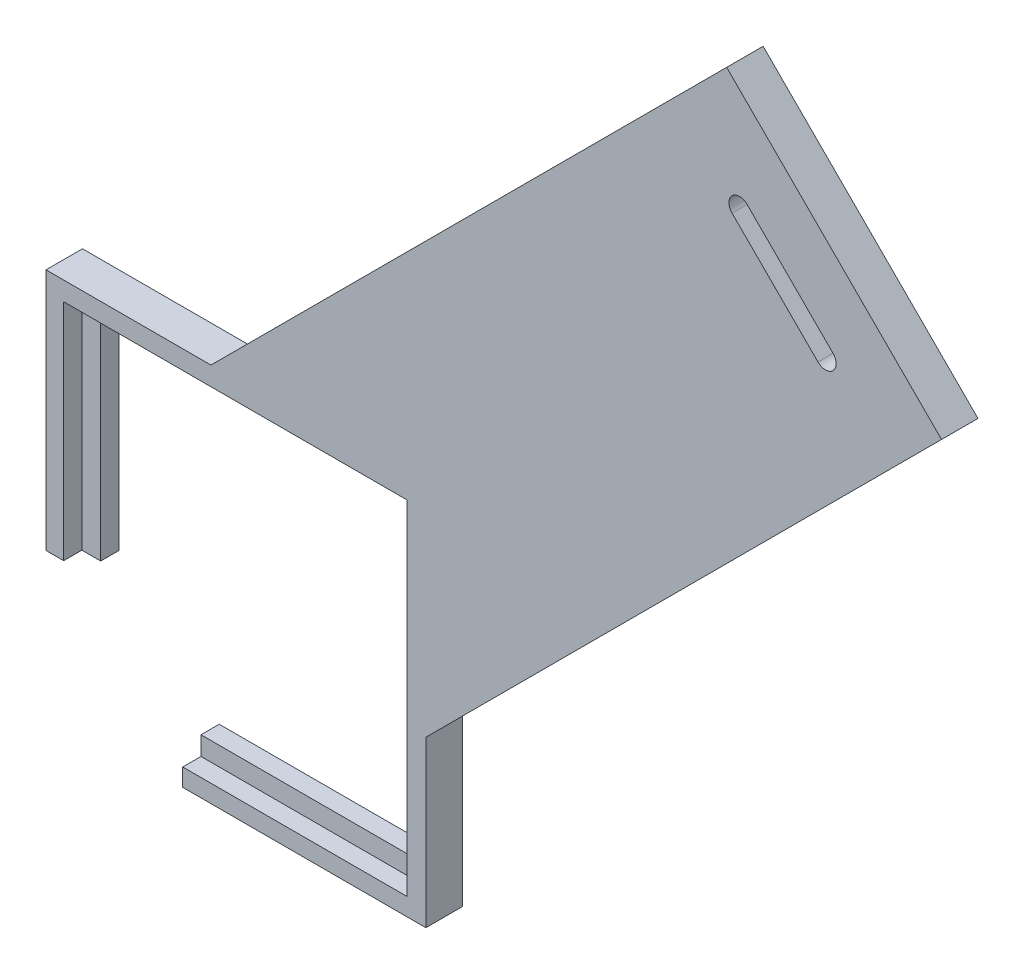
ISO-10303-21;
HEADER;
FILE_DESCRIPTION(('STEP AP214'),'2;1');
FILE_NAME('part.step','',(''),(''),'','','');
FILE_SCHEMA(('AUTOMOTIVE_DESIGN { 1 0 10303 214 1 1 1 1 }'));
ENDSEC;
DATA;
#1=APPLICATION_CONTEXT('core data for automotive mechanical design processes');
#2=APPLICATION_PROTOCOL_DEFINITION('international standard','automotive_design',2000,#1);
#3=PRODUCT_CONTEXT('',#1,'mechanical');
#4=PRODUCT('Part','Part','',(#3));
#5=PRODUCT_RELATED_PRODUCT_CATEGORY('part','',(#4));
#6=PRODUCT_DEFINITION_FORMATION('','',#4);
#7=PRODUCT_DEFINITION_CONTEXT('part definition',#1,'design');
#8=PRODUCT_DEFINITION('design','',#6,#7);
#9=PRODUCT_DEFINITION_SHAPE('','',#8);
#10=(LENGTH_UNIT() NAMED_UNIT(*) SI_UNIT(.MILLI.,.METRE.));
#11=(NAMED_UNIT(*) PLANE_ANGLE_UNIT() SI_UNIT($,.RADIAN.));
#12=(NAMED_UNIT(*) SI_UNIT($,.STERADIAN.) SOLID_ANGLE_UNIT());
#13=UNCERTAINTY_MEASURE_WITH_UNIT(LENGTH_MEASURE(1.E-05),#10,'distance_accuracy_value','');
#14=(GEOMETRIC_REPRESENTATION_CONTEXT(3) GLOBAL_UNCERTAINTY_ASSIGNED_CONTEXT((#13)) GLOBAL_UNIT_ASSIGNED_CONTEXT((#10,
#11,#12)) REPRESENTATION_CONTEXT('',''));
#15=CARTESIAN_POINT('',(0.,0.,0.));
#16=DIRECTION('',(0.,0.,1.));
#17=DIRECTION('',(1.,0.,0.));
#18=AXIS2_PLACEMENT_3D('',#15,#16,#17);
#19=CARTESIAN_POINT('',(-1.04083408558608E-13,62.5000000000001,6.));
#20=DIRECTION('',(0.,-1.,0.));
#21=DIRECTION('',(1.,0.,0.));
#22=AXIS2_PLACEMENT_3D('',#19,#20,#21);
#23=PLANE('',#22);
#24=DIRECTION('',(-1.,0.,0.));
#25=VECTOR('',#24,1.);
#26=CARTESIAN_POINT('',(-1.04083408558608E-13,62.5000000000001,0.));
#27=LINE('',#26,#25);
#28=CARTESIAN_POINT('',(27.1446609406726,62.5000000000001,0.));
#29=VERTEX_POINT('',#28);
#30=CARTESIAN_POINT('',(-1.04083408558608E-13,62.5000000000001,0.));
#31=VERTEX_POINT('',#30);
#32=EDGE_CURVE('E266',#29,#31,#27,.T.);
#33=ORIENTED_EDGE('',*,*,#32,.T.);
#34=DIRECTION('',(0.,0.,-1.));
#35=VECTOR('',#34,1.);
#36=CARTESIAN_POINT('',(-1.04083408558608E-13,62.5000000000001,6.));
#37=LINE('',#36,#35);
#38=CARTESIAN_POINT('',(-1.04083408558608E-13,62.5000000000001,6.));
#39=VERTEX_POINT('',#38);
#40=EDGE_CURVE('E349',#39,#31,#37,.T.);
#41=ORIENTED_EDGE('',*,*,#40,.F.);
#42=DIRECTION('',(-1.,0.,0.));
#43=VECTOR('',#42,1.);
#44=CARTESIAN_POINT('',(-1.04083408558608E-13,62.5000000000001,6.));
#45=LINE('',#44,#43);
#46=CARTESIAN_POINT('',(27.1446609406726,62.5000000000001,6.));
#47=VERTEX_POINT('',#46);
#48=EDGE_CURVE('E267',#47,#39,#45,.T.);
#49=ORIENTED_EDGE('',*,*,#48,.F.);
#50=DIRECTION('',(0.,0.,-1.));
#51=VECTOR('',#50,1.);
#52=CARTESIAN_POINT('',(27.1446609406726,62.5000000000001,6.));
#53=LINE('',#52,#51);
#54=EDGE_CURVE('E288',#47,#29,#53,.T.);
#55=ORIENTED_EDGE('',*,*,#54,.T.);
#56=EDGE_LOOP('',(#33,#41,#49,#55));
#57=FACE_BOUND('',#56,.T.);
#58=ADVANCED_FACE('F35',(#57),#23,.F.);
#59=CARTESIAN_POINT('',(-1.04083408558608E-13,22.5000000000001,6.));
#60=DIRECTION('',(1.,0.,0.));
#61=DIRECTION('',(0.,0.,-1.));
#62=AXIS2_PLACEMENT_3D('',#59,#60,#61);
#63=PLANE('',#62);
#64=DIRECTION('',(0.,-1.,0.));
#65=VECTOR('',#64,1.);
#66=CARTESIAN_POINT('',(-1.04083408558608E-13,22.5000000000001,0.));
#67=LINE('',#66,#65);
#68=CARTESIAN_POINT('',(-1.04083408558608E-13,22.5000000000001,0.));
#69=VERTEX_POINT('',#68);
#70=EDGE_CURVE('E291',#31,#69,#67,.T.);
#71=ORIENTED_EDGE('',*,*,#70,.T.);
#72=DIRECTION('',(0.,0.,-1.));
#73=VECTOR('',#72,1.);
#74=CARTESIAN_POINT('',(-1.04083408558608E-13,22.5000000000001,6.));
#75=LINE('',#74,#73);
#76=CARTESIAN_POINT('',(-1.04083408558608E-13,22.5000000000001,6.));
#77=VERTEX_POINT('',#76);
#78=EDGE_CURVE('E346',#77,#69,#75,.T.);
#79=ORIENTED_EDGE('',*,*,#78,.F.);
#80=DIRECTION('',(0.,-1.,0.));
#81=VECTOR('',#80,1.);
#82=CARTESIAN_POINT('',(-1.04083408558608E-13,22.5000000000001,6.));
#83=LINE('',#82,#81);
#84=EDGE_CURVE('E270',#39,#77,#83,.T.);
#85=ORIENTED_EDGE('',*,*,#84,.F.);
#86=ORIENTED_EDGE('',*,*,#40,.T.);
#87=EDGE_LOOP('',(#71,#79,#85,#86));
#88=FACE_BOUND('',#87,.T.);
#89=ADVANCED_FACE('F407',(#88),#63,.F.);
#90=CARTESIAN_POINT('',(-1.04083408558608E-13,22.5000000000001,6.));
#91=DIRECTION('',(0.,1.,0.));
#92=DIRECTION('',(0.,0.,1.));
#93=AXIS2_PLACEMENT_3D('',#90,#91,#92);
#94=PLANE('',#93);
#95=DIRECTION('',(-1.,0.,0.));
#96=VECTOR('',#95,1.);
#97=CARTESIAN_POINT('',(-1.04083408558608E-13,22.5000000000001,3.));
#98=LINE('',#97,#96);
#99=CARTESIAN_POINT('',(5.99999999999988,22.5000000000001,3.));
#100=VERTEX_POINT('',#99);
#101=CARTESIAN_POINT('',(2.90653806295707,22.5000000000001,3.));
#102=VERTEX_POINT('',#101);
#103=EDGE_CURVE('E263',#100,#102,#98,.T.);
#104=ORIENTED_EDGE('',*,*,#103,.T.);
#105=DIRECTION('',(0.,0.,1.));
#106=VECTOR('',#105,1.);
#107=CARTESIAN_POINT('',(2.90653806295707,22.5000000000001,6.));
#108=LINE('',#107,#106);
#109=CARTESIAN_POINT('',(2.90653806295707,22.5000000000001,6.));
#110=VERTEX_POINT('',#109);
#111=EDGE_CURVE('E241',#102,#110,#108,.T.);
#112=ORIENTED_EDGE('',*,*,#111,.T.);
#113=DIRECTION('',(1.,0.,0.));
#114=VECTOR('',#113,1.);
#115=CARTESIAN_POINT('',(-1.04083408558608E-13,22.5000000000001,6.));
#116=LINE('',#115,#114);
#117=EDGE_CURVE('E273',#77,#110,#116,.T.);
#118=ORIENTED_EDGE('',*,*,#117,.F.);
#119=ORIENTED_EDGE('',*,*,#78,.T.);
#120=DIRECTION('',(1.,0.,0.));
#121=VECTOR('',#120,1.);
#122=CARTESIAN_POINT('',(-1.04083408558608E-13,22.5000000000001,0.));
#123=LINE('',#122,#121);
#124=CARTESIAN_POINT('',(5.99999999999988,22.5000000000001,0.));
#125=VERTEX_POINT('',#124);
#126=EDGE_CURVE('E293',#69,#125,#123,.T.);
#127=ORIENTED_EDGE('',*,*,#126,.T.);
#128=DIRECTION('',(0.,0.,-1.));
#129=VECTOR('',#128,1.);
#130=CARTESIAN_POINT('',(5.99999999999988,22.5000000000001,6.));
#131=LINE('',#130,#129);
#132=EDGE_CURVE('E344',#100,#125,#131,.T.);
#133=ORIENTED_EDGE('',*,*,#132,.F.);
#134=EDGE_LOOP('',(#104,#112,#118,#119,#127,#133));
#135=FACE_BOUND('',#134,.T.);
#136=ADVANCED_FACE('F410',(#135),#94,.F.);
#137=CARTESIAN_POINT('',(5.99999999999987,56.5000000000001,6.));
#138=DIRECTION('',(-1.,0.,0.));
#139=DIRECTION('',(0.,-1.,0.));
#140=AXIS2_PLACEMENT_3D('',#137,#138,#139);
#141=PLANE('',#140);
#142=DIRECTION('',(0.,0.,-1.));
#143=VECTOR('',#142,1.);
#144=CARTESIAN_POINT('',(5.99999999999987,56.5000000000001,6.));
#145=LINE('',#144,#143);
#146=CARTESIAN_POINT('',(5.99999999999987,56.5000000000001,3.));
#147=VERTEX_POINT('',#146);
#148=CARTESIAN_POINT('',(5.99999999999987,56.5000000000001,0.));
#149=VERTEX_POINT('',#148);
#150=EDGE_CURVE('E342',#147,#149,#145,.T.);
#151=ORIENTED_EDGE('',*,*,#150,.F.);
#152=DIRECTION('',(0.,-1.,0.));
#153=VECTOR('',#152,1.);
#154=CARTESIAN_POINT('',(5.99999999999987,56.5000000000001,3.));
#155=LINE('',#154,#153);
#156=EDGE_CURVE('E260',#147,#100,#155,.T.);
#157=ORIENTED_EDGE('',*,*,#156,.T.);
#158=ORIENTED_EDGE('',*,*,#132,.T.);
#159=DIRECTION('',(0.,1.,0.));
#160=VECTOR('',#159,1.);
#161=CARTESIAN_POINT('',(5.99999999999987,56.5000000000001,0.));
#162=LINE('',#161,#160);
#163=EDGE_CURVE('E296',#125,#149,#162,.T.);
#164=ORIENTED_EDGE('',*,*,#163,.T.);
#165=EDGE_LOOP('',(#151,#157,#158,#164));
#166=FACE_BOUND('',#165,.T.);
#167=ADVANCED_FACE('F416',(#166),#141,.F.);
#168=CARTESIAN_POINT('',(56.4999999999999,56.5000000000001,6.));
#169=DIRECTION('',(0.,1.,0.));
#170=DIRECTION('',(-1.,0.,0.));
#171=AXIS2_PLACEMENT_3D('',#168,#169,#170);
#172=PLANE('',#171);
#173=DIRECTION('',(0.,0.,-1.));
#174=VECTOR('',#173,1.);
#175=CARTESIAN_POINT('',(56.4999999999999,56.5000000000001,6.));
#176=LINE('',#175,#174);
#177=CARTESIAN_POINT('',(56.4999999999999,56.5000000000001,3.));
#178=VERTEX_POINT('',#177);
#179=CARTESIAN_POINT('',(56.4999999999999,56.5000000000001,0.));
#180=VERTEX_POINT('',#179);
#181=EDGE_CURVE('E340',#178,#180,#176,.T.);
#182=ORIENTED_EDGE('',*,*,#181,.F.);
#183=DIRECTION('',(-1.,0.,0.));
#184=VECTOR('',#183,1.);
#185=CARTESIAN_POINT('',(56.4999999999999,56.5000000000001,3.));
#186=LINE('',#185,#184);
#187=EDGE_CURVE('E257',#178,#147,#186,.T.);
#188=ORIENTED_EDGE('',*,*,#187,.T.);
#189=ORIENTED_EDGE('',*,*,#150,.T.);
#190=DIRECTION('',(1.,0.,0.));
#191=VECTOR('',#190,1.);
#192=CARTESIAN_POINT('',(56.4999999999999,56.5000000000001,0.));
#193=LINE('',#192,#191);
#194=EDGE_CURVE('E299',#149,#180,#193,.T.);
#195=ORIENTED_EDGE('',*,*,#194,.T.);
#196=EDGE_LOOP('',(#182,#188,#189,#195));
#197=FACE_BOUND('',#196,.T.);
#198=ADVANCED_FACE('F423',(#197),#172,.F.);
#199=CARTESIAN_POINT('',(56.4999999999999,56.5000000000001,6.));
#200=DIRECTION('',(1.,0.,0.));
#201=DIRECTION('',(0.,1.,0.));
#202=AXIS2_PLACEMENT_3D('',#199,#200,#201);
#203=PLANE('',#202);
#204=DIRECTION('',(0.,0.,-1.));
#205=VECTOR('',#204,1.);
#206=CARTESIAN_POINT('',(56.4999999999999,6.00000000000008,6.));
#207=LINE('',#206,#205);
#208=CARTESIAN_POINT('',(56.4999999999999,6.00000000000008,3.));
#209=VERTEX_POINT('',#208);
#210=CARTESIAN_POINT('',(56.4999999999999,6.00000000000008,0.));
#211=VERTEX_POINT('',#210);
#212=EDGE_CURVE('E338',#209,#211,#207,.T.);
#213=ORIENTED_EDGE('',*,*,#212,.F.);
#214=DIRECTION('',(0.,1.,0.));
#215=VECTOR('',#214,1.);
#216=CARTESIAN_POINT('',(56.4999999999999,56.5000000000001,3.));
#217=LINE('',#216,#215);
#218=EDGE_CURVE('E254',#209,#178,#217,.T.);
#219=ORIENTED_EDGE('',*,*,#218,.T.);
#220=ORIENTED_EDGE('',*,*,#181,.T.);
#221=DIRECTION('',(0.,-1.,0.));
#222=VECTOR('',#221,1.);
#223=CARTESIAN_POINT('',(56.4999999999999,56.5000000000001,0.));
#224=LINE('',#223,#222);
#225=EDGE_CURVE('E302',#180,#211,#224,.T.);
#226=ORIENTED_EDGE('',*,*,#225,.T.);
#227=EDGE_LOOP('',(#213,#219,#220,#226));
#228=FACE_BOUND('',#227,.T.);
#229=ADVANCED_FACE('F426',(#228),#203,.F.);
#230=CARTESIAN_POINT('',(56.4999999999999,6.00000000000008,6.));
#231=DIRECTION('',(0.,-1.,0.));
#232=DIRECTION('',(1.,0.,0.));
#233=AXIS2_PLACEMENT_3D('',#230,#231,#232);
#234=PLANE('',#233);
#235=DIRECTION('',(0.,0.,-1.));
#236=VECTOR('',#235,1.);
#237=CARTESIAN_POINT('',(22.4999999999999,6.00000000000008,6.));
#238=LINE('',#237,#236);
#239=CARTESIAN_POINT('',(22.4999999999999,6.00000000000008,3.));
#240=VERTEX_POINT('',#239);
#241=CARTESIAN_POINT('',(22.4999999999999,6.00000000000008,0.));
#242=VERTEX_POINT('',#241);
#243=EDGE_CURVE('E336',#240,#242,#238,.T.);
#244=ORIENTED_EDGE('',*,*,#243,.F.);
#245=DIRECTION('',(1.,0.,0.));
#246=VECTOR('',#245,1.);
#247=CARTESIAN_POINT('',(56.4999999999999,6.00000000000008,3.));
#248=LINE('',#247,#246);
#249=EDGE_CURVE('E251',#240,#209,#248,.T.);
#250=ORIENTED_EDGE('',*,*,#249,.T.);
#251=ORIENTED_EDGE('',*,*,#212,.T.);
#252=DIRECTION('',(-1.,0.,0.));
#253=VECTOR('',#252,1.);
#254=CARTESIAN_POINT('',(56.4999999999999,6.00000000000008,0.));
#255=LINE('',#254,#253);
#256=EDGE_CURVE('E305',#211,#242,#255,.T.);
#257=ORIENTED_EDGE('',*,*,#256,.T.);
#258=EDGE_LOOP('',(#244,#250,#251,#257));
#259=FACE_BOUND('',#258,.T.);
#260=ADVANCED_FACE('F428',(#259),#234,.F.);
#261=CARTESIAN_POINT('',(22.4999999999999,6.00000000000008,6.));
#262=DIRECTION('',(1.,0.,0.));
#263=DIRECTION('',(0.,0.,-1.));
#264=AXIS2_PLACEMENT_3D('',#261,#262,#263);
#265=PLANE('',#264);
#266=DIRECTION('',(0.,-1.,0.));
#267=VECTOR('',#266,1.);
#268=CARTESIAN_POINT('',(22.4999999999999,6.00000000000008,6.));
#269=LINE('',#268,#267);
#270=CARTESIAN_POINT('',(22.4999999999999,2.90653806295704,6.));
#271=VERTEX_POINT('',#270);
#272=CARTESIAN_POINT('',(22.4999999999999,0.,6.));
#273=VERTEX_POINT('',#272);
#274=EDGE_CURVE('E276',#271,#273,#269,.T.);
#275=ORIENTED_EDGE('',*,*,#274,.F.);
#276=DIRECTION('',(0.,0.,-1.));
#277=VECTOR('',#276,1.);
#278=CARTESIAN_POINT('',(22.4999999999999,2.90653806295704,6.));
#279=LINE('',#278,#277);
#280=CARTESIAN_POINT('',(22.4999999999999,2.90653806295704,3.));
#281=VERTEX_POINT('',#280);
#282=EDGE_CURVE('E248',#271,#281,#279,.T.);
#283=ORIENTED_EDGE('',*,*,#282,.T.);
#284=DIRECTION('',(0.,1.,0.));
#285=VECTOR('',#284,1.);
#286=CARTESIAN_POINT('',(22.4999999999999,6.00000000000008,3.));
#287=LINE('',#286,#285);
#288=EDGE_CURVE('E11',#281,#240,#287,.T.);
#289=ORIENTED_EDGE('',*,*,#288,.T.);
#290=ORIENTED_EDGE('',*,*,#243,.T.);
#291=DIRECTION('',(0.,-1.,0.));
#292=VECTOR('',#291,1.);
#293=CARTESIAN_POINT('',(22.4999999999999,6.00000000000008,0.));
#294=LINE('',#293,#292);
#295=CARTESIAN_POINT('',(22.4999999999999,0.,0.));
#296=VERTEX_POINT('',#295);
#297=EDGE_CURVE('E308',#242,#296,#294,.T.);
#298=ORIENTED_EDGE('',*,*,#297,.T.);
#299=DIRECTION('',(0.,0.,-1.));
#300=VECTOR('',#299,1.);
#301=CARTESIAN_POINT('',(22.4999999999999,0.,6.));
#302=LINE('',#301,#300);
#303=EDGE_CURVE('E333',#273,#296,#302,.T.);
#304=ORIENTED_EDGE('',*,*,#303,.F.);
#305=EDGE_LOOP('',(#275,#283,#289,#290,#298,#304));
#306=FACE_BOUND('',#305,.T.);
#307=ADVANCED_FACE('F372',(#306),#265,.F.);
#308=CARTESIAN_POINT('',(22.4999999999999,0.,6.));
#309=DIRECTION('',(0.,1.,0.));
#310=DIRECTION('',(-1.,0.,0.));
#311=AXIS2_PLACEMENT_3D('',#308,#309,#310);
#312=PLANE('',#311);
#313=DIRECTION('',(1.,0.,0.));
#314=VECTOR('',#313,1.);
#315=CARTESIAN_POINT('',(22.4999999999999,0.,0.));
#316=LINE('',#315,#314);
#317=CARTESIAN_POINT('',(62.4999999999999,0.,0.));
#318=VERTEX_POINT('',#317);
#319=EDGE_CURVE('E310',#296,#318,#316,.T.);
#320=ORIENTED_EDGE('',*,*,#319,.T.);
#321=DIRECTION('',(0.,0.,-1.));
#322=VECTOR('',#321,1.);
#323=CARTESIAN_POINT('',(62.4999999999999,0.,6.));
#324=LINE('',#323,#322);
#325=CARTESIAN_POINT('',(62.4999999999999,0.,6.));
#326=VERTEX_POINT('',#325);
#327=EDGE_CURVE('E330',#326,#318,#324,.T.);
#328=ORIENTED_EDGE('',*,*,#327,.F.);
#329=DIRECTION('',(1.,0.,0.));
#330=VECTOR('',#329,1.);
#331=CARTESIAN_POINT('',(22.4999999999999,0.,6.));
#332=LINE('',#331,#330);
#333=EDGE_CURVE('E278',#273,#326,#332,.T.);
#334=ORIENTED_EDGE('',*,*,#333,.F.);
#335=ORIENTED_EDGE('',*,*,#303,.T.);
#336=EDGE_LOOP('',(#320,#328,#334,#335));
#337=FACE_BOUND('',#336,.T.);
#338=ADVANCED_FACE('F380',(#337),#312,.F.);
#339=CARTESIAN_POINT('',(62.4999999999999,0.,6.));
#340=DIRECTION('',(-1.,0.,0.));
#341=DIRECTION('',(0.,-1.,0.));
#342=AXIS2_PLACEMENT_3D('',#339,#340,#341);
#343=PLANE('',#342);
#344=DIRECTION('',(0.,1.,0.));
#345=VECTOR('',#344,1.);
#346=CARTESIAN_POINT('',(62.4999999999999,0.,0.));
#347=LINE('',#346,#345);
#348=CARTESIAN_POINT('',(62.4999999999999,27.1446609406727,0.));
#349=VERTEX_POINT('',#348);
#350=EDGE_CURVE('E312',#318,#349,#347,.T.);
#351=ORIENTED_EDGE('',*,*,#350,.T.);
#352=DIRECTION('',(0.,0.,-1.));
#353=VECTOR('',#352,1.);
#354=CARTESIAN_POINT('',(62.4999999999999,27.1446609406727,6.));
#355=LINE('',#354,#353);
#356=CARTESIAN_POINT('',(62.4999999999999,27.1446609406727,6.));
#357=VERTEX_POINT('',#356);
#358=EDGE_CURVE('E327',#357,#349,#355,.T.);
#359=ORIENTED_EDGE('',*,*,#358,.F.);
#360=DIRECTION('',(0.,1.,0.));
#361=VECTOR('',#360,1.);
#362=CARTESIAN_POINT('',(62.4999999999999,0.,6.));
#363=LINE('',#362,#361);
#364=EDGE_CURVE('E280',#326,#357,#363,.T.);
#365=ORIENTED_EDGE('',*,*,#364,.F.);
#366=ORIENTED_EDGE('',*,*,#327,.T.);
#367=EDGE_LOOP('',(#351,#359,#365,#366));
#368=FACE_BOUND('',#367,.T.);
#369=ADVANCED_FACE('F384',(#368),#343,.F.);
#370=CARTESIAN_POINT('',(147.352813742386,111.997474683059,6.));
#371=DIRECTION('',(-0.707106781186549,0.707106781186546,0.));
#372=DIRECTION('',(-0.707106781186546,-0.707106781186549,0.));
#373=AXIS2_PLACEMENT_3D('',#370,#371,#372);
#374=PLANE('',#373);
#375=DIRECTION('',(0.707106781186546,0.707106781186549,0.));
#376=VECTOR('',#375,1.);
#377=CARTESIAN_POINT('',(147.352813742386,111.997474683059,0.));
#378=LINE('',#377,#376);
#379=CARTESIAN_POINT('',(147.352813742386,111.997474683059,0.));
#380=VERTEX_POINT('',#379);
#381=EDGE_CURVE('E314',#349,#380,#378,.T.);
#382=ORIENTED_EDGE('',*,*,#381,.T.);
#383=DIRECTION('',(0.,0.,-1.));
#384=VECTOR('',#383,1.);
#385=CARTESIAN_POINT('',(147.352813742386,111.997474683059,6.));
#386=LINE('',#385,#384);
#387=CARTESIAN_POINT('',(147.352813742386,111.997474683059,6.));
#388=VERTEX_POINT('',#387);
#389=EDGE_CURVE('E324',#388,#380,#386,.T.);
#390=ORIENTED_EDGE('',*,*,#389,.F.);
#391=DIRECTION('',(0.707106781186546,0.707106781186549,0.));
#392=VECTOR('',#391,1.);
#393=CARTESIAN_POINT('',(147.352813742386,111.997474683059,6.));
#394=LINE('',#393,#392);
#395=EDGE_CURVE('E282',#357,#388,#394,.T.);
#396=ORIENTED_EDGE('',*,*,#395,.F.);
#397=ORIENTED_EDGE('',*,*,#358,.T.);
#398=EDGE_LOOP('',(#382,#390,#396,#397));
#399=FACE_BOUND('',#398,.T.);
#400=ADVANCED_FACE('F389',(#399),#374,.F.);
#401=CARTESIAN_POINT('',(111.997474683058,147.352813742386,6.));
#402=DIRECTION('',(-0.707106781186546,-0.707106781186549,0.));
#403=DIRECTION('',(0.707106781186549,-0.707106781186546,0.));
#404=AXIS2_PLACEMENT_3D('',#401,#402,#403);
#405=PLANE('',#404);
#406=DIRECTION('',(-0.707106781186549,0.707106781186546,0.));
#407=VECTOR('',#406,1.);
#408=CARTESIAN_POINT('',(111.997474683058,147.352813742386,0.));
#409=LINE('',#408,#407);
#410=CARTESIAN_POINT('',(111.997474683058,147.352813742386,0.));
#411=VERTEX_POINT('',#410);
#412=EDGE_CURVE('E316',#380,#411,#409,.T.);
#413=ORIENTED_EDGE('',*,*,#412,.T.);
#414=DIRECTION('',(0.,0.,-1.));
#415=VECTOR('',#414,1.);
#416=CARTESIAN_POINT('',(111.997474683058,147.352813742386,6.));
#417=LINE('',#416,#415);
#418=CARTESIAN_POINT('',(111.997474683058,147.352813742386,6.));
#419=VERTEX_POINT('',#418);
#420=EDGE_CURVE('E321',#419,#411,#417,.T.);
#421=ORIENTED_EDGE('',*,*,#420,.F.);
#422=DIRECTION('',(-0.707106781186549,0.707106781186546,0.));
#423=VECTOR('',#422,1.);
#424=CARTESIAN_POINT('',(111.997474683058,147.352813742386,6.));
#425=LINE('',#424,#423);
#426=EDGE_CURVE('E284',#388,#419,#425,.T.);
#427=ORIENTED_EDGE('',*,*,#426,.F.);
#428=ORIENTED_EDGE('',*,*,#389,.T.);
#429=EDGE_LOOP('',(#413,#421,#427,#428));
#430=FACE_BOUND('',#429,.T.);
#431=ADVANCED_FACE('F395',(#430),#405,.F.);
#432=CARTESIAN_POINT('',(27.1446609406726,62.5000000000001,6.));
#433=DIRECTION('',(0.707106781186549,-0.707106781186546,0.));
#434=DIRECTION('',(0.707106781186546,0.707106781186549,0.));
#435=AXIS2_PLACEMENT_3D('',#432,#433,#434);
#436=PLANE('',#435);
#437=DIRECTION('',(-0.707106781186546,-0.707106781186549,0.));
#438=VECTOR('',#437,1.);
#439=CARTESIAN_POINT('',(27.1446609406726,62.5000000000001,0.));
#440=LINE('',#439,#438);
#441=EDGE_CURVE('E271',#411,#29,#440,.T.);
#442=ORIENTED_EDGE('',*,*,#441,.T.);
#443=ORIENTED_EDGE('',*,*,#54,.F.);
#444=DIRECTION('',(-0.707106781186546,-0.707106781186549,0.));
#445=VECTOR('',#444,1.);
#446=CARTESIAN_POINT('',(27.1446609406726,62.5000000000001,6.));
#447=LINE('',#446,#445);
#448=EDGE_CURVE('E286',#419,#47,#447,.T.);
#449=ORIENTED_EDGE('',*,*,#448,.F.);
#450=ORIENTED_EDGE('',*,*,#420,.T.);
#451=EDGE_LOOP('',(#442,#443,#449,#450));
#452=FACE_BOUND('',#451,.T.);
#453=ADVANCED_FACE('F399',(#452),#436,.F.);
#454=CARTESIAN_POINT('',(0.,0.,6.));
#455=DIRECTION('',(0.,0.,1.));
#456=DIRECTION('',(1.,0.,0.));
#457=AXIS2_PLACEMENT_3D('',#454,#455,#456);
#458=PLANE('',#457);
#459=CARTESIAN_POINT('',(114.118795026618,128.260930650349,6.));
#460=DIRECTION('',(0.,0.,1.));
#461=DIRECTION('',(-1.,0.,0.));
#462=AXIS2_PLACEMENT_3D('',#459,#460,#461);
#463=CIRCLE('',#462,1.75000000000001);
#464=CARTESIAN_POINT('',(115.356231893694,129.498367517426,6.));
#465=VERTEX_POINT('',#464);
#466=CARTESIAN_POINT('',(112.881358159541,127.023493783273,6.));
#467=VERTEX_POINT('',#466);
#468=EDGE_CURVE('E49',#465,#467,#463,.T.);
#469=ORIENTED_EDGE('',*,*,#468,.F.);
#470=DIRECTION('',(-0.707106781186549,0.707106781186546,0.));
#471=VECTOR('',#470,1.);
#472=CARTESIAN_POINT('',(115.356231893694,129.498367517426,6.));
#473=LINE('',#472,#471);
#474=CARTESIAN_POINT('',(129.498367517425,115.356231893695,6.));
#475=VERTEX_POINT('',#474);
#476=EDGE_CURVE('E201',#475,#465,#473,.T.);
#477=ORIENTED_EDGE('',*,*,#476,.F.);
#478=CARTESIAN_POINT('',(128.260930650349,114.118795026618,6.));
#479=DIRECTION('',(0.,0.,1.));
#480=DIRECTION('',(1.,0.,0.));
#481=AXIS2_PLACEMENT_3D('',#478,#479,#480);
#482=CIRCLE('',#481,1.74999999999999);
#483=CARTESIAN_POINT('',(127.023493783272,112.881358159542,6.));
#484=VERTEX_POINT('',#483);
#485=EDGE_CURVE('E204',#484,#475,#482,.T.);
#486=ORIENTED_EDGE('',*,*,#485,.F.);
#487=DIRECTION('',(0.70710678118655,-0.707106781186545,0.));
#488=VECTOR('',#487,1.);
#489=CARTESIAN_POINT('',(112.881358159541,127.023493783273,6.));
#490=LINE('',#489,#488);
#491=EDGE_CURVE('E210',#467,#484,#490,.T.);
#492=ORIENTED_EDGE('',*,*,#491,.F.);
#493=EDGE_LOOP('',(#469,#477,#486,#492));
#494=FACE_BOUND('',#493,.T.);
#495=DIRECTION('',(1.,0.,0.));
#496=VECTOR('',#495,1.);
#497=CARTESIAN_POINT('',(0.,2.90653806295704,6.));
#498=LINE('',#497,#496);
#499=CARTESIAN_POINT('',(59.4065380629571,2.90653806295705,6.));
#500=VERTEX_POINT('',#499);
#501=EDGE_CURVE('E42',#271,#500,#498,.T.);
#502=ORIENTED_EDGE('',*,*,#501,.F.);
#503=ORIENTED_EDGE('',*,*,#274,.T.);
#504=ORIENTED_EDGE('',*,*,#333,.T.);
#505=ORIENTED_EDGE('',*,*,#364,.T.);
#506=ORIENTED_EDGE('',*,*,#395,.T.);
#507=ORIENTED_EDGE('',*,*,#426,.T.);
#508=ORIENTED_EDGE('',*,*,#448,.T.);
#509=ORIENTED_EDGE('',*,*,#48,.T.);
#510=ORIENTED_EDGE('',*,*,#84,.T.);
#511=ORIENTED_EDGE('',*,*,#117,.T.);
#512=DIRECTION('',(0.,-1.,0.));
#513=VECTOR('',#512,1.);
#514=CARTESIAN_POINT('',(2.90653806295707,59.406538062957,6.));
#515=LINE('',#514,#513);
#516=CARTESIAN_POINT('',(2.90653806295707,59.406538062957,6.));
#517=VERTEX_POINT('',#516);
#518=EDGE_CURVE('E224',#517,#110,#515,.T.);
#519=ORIENTED_EDGE('',*,*,#518,.F.);
#520=DIRECTION('',(-1.,0.,0.));
#521=VECTOR('',#520,1.);
#522=CARTESIAN_POINT('',(59.4065380629571,59.4065380629571,6.));
#523=LINE('',#522,#521);
#524=CARTESIAN_POINT('',(59.4065380629571,59.4065380629571,6.));
#525=VERTEX_POINT('',#524);
#526=EDGE_CURVE('E234',#525,#517,#523,.T.);
#527=ORIENTED_EDGE('',*,*,#526,.F.);
#528=DIRECTION('',(0.,1.,0.));
#529=VECTOR('',#528,1.);
#530=CARTESIAN_POINT('',(59.4065380629571,59.4065380629571,6.));
#531=LINE('',#530,#529);
#532=EDGE_CURVE('E216',#500,#525,#531,.T.);
#533=ORIENTED_EDGE('',*,*,#532,.F.);
#534=EDGE_LOOP('',(#502,#503,#504,#505,#506,#507,#508,#509,#510,#511,#519,#527,#533));
#535=FACE_BOUND('',#534,.T.);
#536=ADVANCED_FACE('F363',(#494,#535),#458,.T.);
#537=CARTESIAN_POINT('',(0.,0.,0.));
#538=DIRECTION('',(0.,0.,1.));
#539=DIRECTION('',(1.,0.,0.));
#540=AXIS2_PLACEMENT_3D('',#537,#538,#539);
#541=PLANE('',#540);
#542=DIRECTION('',(-0.707106781186549,0.707106781186546,0.));
#543=VECTOR('',#542,1.);
#544=CARTESIAN_POINT('',(115.356231893694,129.498367517426,0.));
#545=LINE('',#544,#543);
#546=CARTESIAN_POINT('',(129.498367517425,115.356231893695,0.));
#547=VERTEX_POINT('',#546);
#548=CARTESIAN_POINT('',(115.356231893694,129.498367517426,0.));
#549=VERTEX_POINT('',#548);
#550=EDGE_CURVE('E191',#547,#549,#545,.T.);
#551=ORIENTED_EDGE('',*,*,#550,.T.);
#552=CARTESIAN_POINT('',(114.118795026618,128.260930650349,0.));
#553=DIRECTION('',(0.,0.,1.));
#554=DIRECTION('',(-1.,0.,0.));
#555=AXIS2_PLACEMENT_3D('',#552,#553,#554);
#556=CIRCLE('',#555,1.75000000000001);
#557=CARTESIAN_POINT('',(112.881358159541,127.023493783273,0.));
#558=VERTEX_POINT('',#557);
#559=EDGE_CURVE('E185',#549,#558,#556,.T.);
#560=ORIENTED_EDGE('',*,*,#559,.T.);
#561=DIRECTION('',(0.70710678118655,-0.707106781186545,0.));
#562=VECTOR('',#561,1.);
#563=CARTESIAN_POINT('',(112.881358159541,127.023493783273,0.));
#564=LINE('',#563,#562);
#565=CARTESIAN_POINT('',(127.023493783272,112.881358159542,0.));
#566=VERTEX_POINT('',#565);
#567=EDGE_CURVE('E194',#558,#566,#564,.T.);
#568=ORIENTED_EDGE('',*,*,#567,.T.);
#569=CARTESIAN_POINT('',(128.260930650349,114.118795026618,0.));
#570=DIRECTION('',(0.,0.,1.));
#571=DIRECTION('',(1.,0.,0.));
#572=AXIS2_PLACEMENT_3D('',#569,#570,#571);
#573=CIRCLE('',#572,1.74999999999999);
#574=EDGE_CURVE('E57',#566,#547,#573,.T.);
#575=ORIENTED_EDGE('',*,*,#574,.T.);
#576=EDGE_LOOP('',(#551,#560,#568,#575));
#577=FACE_BOUND('',#576,.T.);
#578=ORIENTED_EDGE('',*,*,#32,.F.);
#579=ORIENTED_EDGE('',*,*,#441,.F.);
#580=ORIENTED_EDGE('',*,*,#412,.F.);
#581=ORIENTED_EDGE('',*,*,#381,.F.);
#582=ORIENTED_EDGE('',*,*,#350,.F.);
#583=ORIENTED_EDGE('',*,*,#319,.F.);
#584=ORIENTED_EDGE('',*,*,#297,.F.);
#585=ORIENTED_EDGE('',*,*,#256,.F.);
#586=ORIENTED_EDGE('',*,*,#225,.F.);
#587=ORIENTED_EDGE('',*,*,#194,.F.);
#588=ORIENTED_EDGE('',*,*,#163,.F.);
#589=ORIENTED_EDGE('',*,*,#126,.F.);
#590=ORIENTED_EDGE('',*,*,#70,.F.);
#591=EDGE_LOOP('',(#578,#579,#580,#581,#582,#583,#584,#585,#586,#587,#588,#589,#590));
#592=FACE_BOUND('',#591,.T.);
#593=ADVANCED_FACE('F198',(#577,#592),#541,.F.);
#594=CARTESIAN_POINT('',(0.,0.,3.));
#595=DIRECTION('',(0.,0.,-1.));
#596=DIRECTION('',(-1.,0.,0.));
#597=AXIS2_PLACEMENT_3D('',#594,#595,#596);
#598=PLANE('',#597);
#599=ORIENTED_EDGE('',*,*,#156,.F.);
#600=ORIENTED_EDGE('',*,*,#187,.F.);
#601=ORIENTED_EDGE('',*,*,#218,.F.);
#602=ORIENTED_EDGE('',*,*,#249,.F.);
#603=ORIENTED_EDGE('',*,*,#288,.F.);
#604=DIRECTION('',(1.,0.,0.));
#605=VECTOR('',#604,1.);
#606=CARTESIAN_POINT('',(59.4065380629571,2.90653806295705,3.));
#607=LINE('',#606,#605);
#608=CARTESIAN_POINT('',(59.4065380629571,2.90653806295705,3.));
#609=VERTEX_POINT('',#608);
#610=EDGE_CURVE('E230',#281,#609,#607,.T.);
#611=ORIENTED_EDGE('',*,*,#610,.T.);
#612=DIRECTION('',(0.,1.,0.));
#613=VECTOR('',#612,1.);
#614=CARTESIAN_POINT('',(59.4065380629571,59.4065380629571,3.));
#615=LINE('',#614,#613);
#616=CARTESIAN_POINT('',(59.4065380629571,59.4065380629571,3.));
#617=VERTEX_POINT('',#616);
#618=EDGE_CURVE('E220',#609,#617,#615,.T.);
#619=ORIENTED_EDGE('',*,*,#618,.T.);
#620=DIRECTION('',(-1.,0.,0.));
#621=VECTOR('',#620,1.);
#622=CARTESIAN_POINT('',(59.4065380629571,59.4065380629571,3.));
#623=LINE('',#622,#621);
#624=CARTESIAN_POINT('',(2.90653806295707,59.406538062957,3.));
#625=VERTEX_POINT('',#624);
#626=EDGE_CURVE('E223',#617,#625,#623,.T.);
#627=ORIENTED_EDGE('',*,*,#626,.T.);
#628=DIRECTION('',(0.,-1.,0.));
#629=VECTOR('',#628,1.);
#630=CARTESIAN_POINT('',(2.90653806295707,59.406538062957,3.));
#631=LINE('',#630,#629);
#632=EDGE_CURVE('E227',#625,#102,#631,.T.);
#633=ORIENTED_EDGE('',*,*,#632,.T.);
#634=ORIENTED_EDGE('',*,*,#103,.F.);
#635=EDGE_LOOP('',(#599,#600,#601,#602,#603,#611,#619,#627,#633,#634));
#636=FACE_BOUND('',#635,.T.);
#637=ADVANCED_FACE('F370',(#636),#598,.F.);
#638=CARTESIAN_POINT('',(59.4065380629571,2.90653806295705,3.));
#639=DIRECTION('',(0.,-1.,0.));
#640=DIRECTION('',(1.,0.,0.));
#641=AXIS2_PLACEMENT_3D('',#638,#639,#640);
#642=PLANE('',#641);
#643=ORIENTED_EDGE('',*,*,#501,.T.);
#644=DIRECTION('',(0.,0.,1.));
#645=VECTOR('',#644,1.);
#646=CARTESIAN_POINT('',(59.4065380629571,2.90653806295705,3.));
#647=LINE('',#646,#645);
#648=EDGE_CURVE('E238',#609,#500,#647,.T.);
#649=ORIENTED_EDGE('',*,*,#648,.F.);
#650=ORIENTED_EDGE('',*,*,#610,.F.);
#651=ORIENTED_EDGE('',*,*,#282,.F.);
#652=EDGE_LOOP('',(#643,#649,#650,#651));
#653=FACE_BOUND('',#652,.T.);
#654=ADVANCED_FACE('F354',(#653),#642,.F.);
#655=CARTESIAN_POINT('',(2.90653806295707,59.406538062957,3.));
#656=DIRECTION('',(-1.,0.,0.));
#657=DIRECTION('',(0.,-1.,0.));
#658=AXIS2_PLACEMENT_3D('',#655,#656,#657);
#659=PLANE('',#658);
#660=ORIENTED_EDGE('',*,*,#632,.F.);
#661=DIRECTION('',(0.,0.,1.));
#662=VECTOR('',#661,1.);
#663=CARTESIAN_POINT('',(2.90653806295707,59.406538062957,3.));
#664=LINE('',#663,#662);
#665=EDGE_CURVE('E242',#625,#517,#664,.T.);
#666=ORIENTED_EDGE('',*,*,#665,.T.);
#667=ORIENTED_EDGE('',*,*,#518,.T.);
#668=ORIENTED_EDGE('',*,*,#111,.F.);
#669=EDGE_LOOP('',(#660,#666,#667,#668));
#670=FACE_BOUND('',#669,.T.);
#671=ADVANCED_FACE('F413',(#670),#659,.F.);
#672=CARTESIAN_POINT('',(59.4065380629571,59.4065380629571,3.));
#673=DIRECTION('',(1.,0.,0.));
#674=DIRECTION('',(0.,1.,0.));
#675=AXIS2_PLACEMENT_3D('',#672,#673,#674);
#676=PLANE('',#675);
#677=ORIENTED_EDGE('',*,*,#532,.T.);
#678=DIRECTION('',(0.,0.,1.));
#679=VECTOR('',#678,1.);
#680=CARTESIAN_POINT('',(59.4065380629571,59.4065380629571,3.));
#681=LINE('',#680,#679);
#682=EDGE_CURVE('E232',#617,#525,#681,.T.);
#683=ORIENTED_EDGE('',*,*,#682,.F.);
#684=ORIENTED_EDGE('',*,*,#618,.F.);
#685=ORIENTED_EDGE('',*,*,#648,.T.);
#686=EDGE_LOOP('',(#677,#683,#684,#685));
#687=FACE_BOUND('',#686,.T.);
#688=ADVANCED_FACE('F361',(#687),#676,.F.);
#689=CARTESIAN_POINT('',(59.4065380629571,59.4065380629571,3.));
#690=DIRECTION('',(0.,1.,0.));
#691=DIRECTION('',(-1.,0.,0.));
#692=AXIS2_PLACEMENT_3D('',#689,#690,#691);
#693=PLANE('',#692);
#694=ORIENTED_EDGE('',*,*,#526,.T.);
#695=ORIENTED_EDGE('',*,*,#665,.F.);
#696=ORIENTED_EDGE('',*,*,#626,.F.);
#697=ORIENTED_EDGE('',*,*,#682,.T.);
#698=EDGE_LOOP('',(#694,#695,#696,#697));
#699=FACE_BOUND('',#698,.T.);
#700=ADVANCED_FACE('F366',(#699),#693,.F.);
#701=CARTESIAN_POINT('',(114.118795026618,128.260930650349,0.));
#702=DIRECTION('',(0.,0.,1.));
#703=DIRECTION('',(1.,0.,0.));
#704=AXIS2_PLACEMENT_3D('',#701,#702,#703);
#705=CYLINDRICAL_SURFACE('',#704,1.75000000000001);
#706=ORIENTED_EDGE('',*,*,#468,.T.);
#707=DIRECTION('',(0.,0.,1.));
#708=VECTOR('',#707,1.);
#709=CARTESIAN_POINT('',(112.881358159541,127.023493783273,0.));
#710=LINE('',#709,#708);
#711=EDGE_CURVE('E181',#558,#467,#710,.T.);
#712=ORIENTED_EDGE('',*,*,#711,.F.);
#713=ORIENTED_EDGE('',*,*,#559,.F.);
#714=DIRECTION('',(0.,0.,1.));
#715=VECTOR('',#714,1.);
#716=CARTESIAN_POINT('',(115.356231893694,129.498367517426,0.));
#717=LINE('',#716,#715);
#718=EDGE_CURVE('E214',#549,#465,#717,.T.);
#719=ORIENTED_EDGE('',*,*,#718,.T.);
#720=EDGE_LOOP('',(#706,#712,#713,#719));
#721=FACE_BOUND('',#720,.T.);
#722=ADVANCED_FACE('F183',(#721),#705,.F.);
#723=CARTESIAN_POINT('',(115.356231893694,129.498367517426,0.));
#724=DIRECTION('',(0.707106781186546,0.707106781186548,0.));
#725=DIRECTION('',(-0.707106781186549,0.707106781186546,0.));
#726=AXIS2_PLACEMENT_3D('',#723,#724,#725);
#727=PLANE('',#726);
#728=ORIENTED_EDGE('',*,*,#476,.T.);
#729=ORIENTED_EDGE('',*,*,#718,.F.);
#730=ORIENTED_EDGE('',*,*,#550,.F.);
#731=DIRECTION('',(0.,0.,1.));
#732=VECTOR('',#731,1.);
#733=CARTESIAN_POINT('',(129.498367517425,115.356231893695,0.));
#734=LINE('',#733,#732);
#735=EDGE_CURVE('E217',#547,#475,#734,.T.);
#736=ORIENTED_EDGE('',*,*,#735,.T.);
#737=EDGE_LOOP('',(#728,#729,#730,#736));
#738=FACE_BOUND('',#737,.T.);
#739=ADVANCED_FACE('F538',(#738),#727,.F.);
#740=CARTESIAN_POINT('',(128.260930650349,114.118795026618,0.));
#741=DIRECTION('',(0.,0.,1.));
#742=DIRECTION('',(1.,0.,0.));
#743=AXIS2_PLACEMENT_3D('',#740,#741,#742);
#744=CYLINDRICAL_SURFACE('',#743,1.74999999999999);
#745=ORIENTED_EDGE('',*,*,#485,.T.);
#746=ORIENTED_EDGE('',*,*,#735,.F.);
#747=ORIENTED_EDGE('',*,*,#574,.F.);
#748=DIRECTION('',(0.,0.,1.));
#749=VECTOR('',#748,1.);
#750=CARTESIAN_POINT('',(127.023493783272,112.881358159542,0.));
#751=LINE('',#750,#749);
#752=EDGE_CURVE('E190',#566,#484,#751,.T.);
#753=ORIENTED_EDGE('',*,*,#752,.T.);
#754=EDGE_LOOP('',(#745,#746,#747,#753));
#755=FACE_BOUND('',#754,.T.);
#756=ADVANCED_FACE('F547',(#755),#744,.F.);
#757=CARTESIAN_POINT('',(112.881358159541,127.023493783273,0.));
#758=DIRECTION('',(-0.707106781186545,-0.70710678118655,0.));
#759=DIRECTION('',(0.70710678118655,-0.707106781186545,0.));
#760=AXIS2_PLACEMENT_3D('',#757,#758,#759);
#761=PLANE('',#760);
#762=ORIENTED_EDGE('',*,*,#491,.T.);
#763=ORIENTED_EDGE('',*,*,#752,.F.);
#764=ORIENTED_EDGE('',*,*,#567,.F.);
#765=ORIENTED_EDGE('',*,*,#711,.T.);
#766=EDGE_LOOP('',(#762,#763,#764,#765));
#767=FACE_BOUND('',#766,.T.);
#768=ADVANCED_FACE('F195',(#767),#761,.F.);
#769=CLOSED_SHELL('',(#58,#89,#136,#167,#198,#229,#260,#307,#338,#369,#400,#431,#453,#536,#593,
#637,#654,#671,#688,#700,#722,#739,#756,#768));
#770=MANIFOLD_SOLID_BREP('B2',#769);
#771=ADVANCED_BREP_SHAPE_REPRESENTATION('',(#18,#770),#14);
#772=SHAPE_DEFINITION_REPRESENTATION(#9,#771);
ENDSEC;
END-ISO-10303-21;
